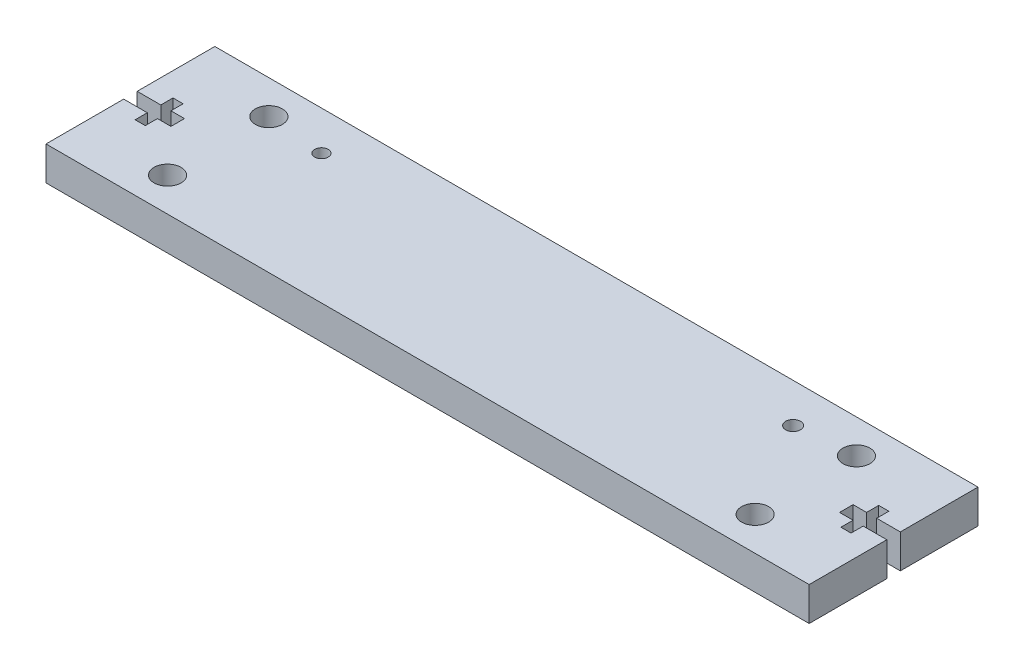
ISO-10303-21;
HEADER;
FILE_DESCRIPTION(('STEP AP214'),'2;1');
FILE_NAME('part.step','',(''),(''),'','','');
FILE_SCHEMA(('AUTOMOTIVE_DESIGN { 1 0 10303 214 1 1 1 1 }'));
ENDSEC;
DATA;
#1=APPLICATION_CONTEXT('core data for automotive mechanical design processes');
#2=APPLICATION_PROTOCOL_DEFINITION('international standard','automotive_design',2000,#1);
#3=PRODUCT_CONTEXT('',#1,'mechanical');
#4=PRODUCT('Part','Part','',(#3));
#5=PRODUCT_RELATED_PRODUCT_CATEGORY('part','',(#4));
#6=PRODUCT_DEFINITION_FORMATION('','',#4);
#7=PRODUCT_DEFINITION_CONTEXT('part definition',#1,'design');
#8=PRODUCT_DEFINITION('design','',#6,#7);
#9=PRODUCT_DEFINITION_SHAPE('','',#8);
#10=(LENGTH_UNIT() NAMED_UNIT(*) SI_UNIT(.MILLI.,.METRE.));
#11=(NAMED_UNIT(*) PLANE_ANGLE_UNIT() SI_UNIT($,.RADIAN.));
#12=(NAMED_UNIT(*) SI_UNIT($,.STERADIAN.) SOLID_ANGLE_UNIT());
#13=UNCERTAINTY_MEASURE_WITH_UNIT(LENGTH_MEASURE(1.E-05),#10,'distance_accuracy_value','');
#14=(GEOMETRIC_REPRESENTATION_CONTEXT(3) GLOBAL_UNCERTAINTY_ASSIGNED_CONTEXT((#13)) GLOBAL_UNIT_ASSIGNED_CONTEXT((#10,
#11,#12)) REPRESENTATION_CONTEXT('',''));
#15=CARTESIAN_POINT('',(0.,0.,0.));
#16=DIRECTION('',(0.,0.,1.));
#17=DIRECTION('',(1.,0.,0.));
#18=AXIS2_PLACEMENT_3D('',#15,#16,#17);
#19=CARTESIAN_POINT('',(-47.2682835486324,5.,-18.4839795938046));
#20=DIRECTION('',(1.,0.,0.));
#21=DIRECTION('',(0.,0.,-1.));
#22=AXIS2_PLACEMENT_3D('',#19,#20,#21);
#23=PLANE('',#22);
#24=DIRECTION('',(0.,1.,0.));
#25=VECTOR('',#24,1.);
#26=CARTESIAN_POINT('',(-47.2682835486325,0.,-6.98397959380457));
#27=LINE('',#26,#25);
#28=CARTESIAN_POINT('',(-47.2682835486325,0.,-6.98397959380457));
#29=VERTEX_POINT('',#28);
#30=CARTESIAN_POINT('',(-47.2682835486325,5.,-6.98397959380457));
#31=VERTEX_POINT('',#30);
#32=EDGE_CURVE('E349',#29,#31,#27,.T.);
#33=ORIENTED_EDGE('',*,*,#32,.T.);
#34=DIRECTION('',(0.,0.,1.));
#35=VECTOR('',#34,1.);
#36=CARTESIAN_POINT('',(-47.2682835486324,5.,-18.4839795938046));
#37=LINE('',#36,#35);
#38=CARTESIAN_POINT('',(-47.2682835486324,5.,-18.4839795938046));
#39=VERTEX_POINT('',#38);
#40=EDGE_CURVE('E455',#39,#31,#37,.T.);
#41=ORIENTED_EDGE('',*,*,#40,.F.);
#42=DIRECTION('',(0.,-1.,0.));
#43=VECTOR('',#42,1.);
#44=CARTESIAN_POINT('',(-47.2682835486324,5.,-18.4839795938046));
#45=LINE('',#44,#43);
#46=CARTESIAN_POINT('',(-47.2682835486324,0.,-18.4839795938046));
#47=VERTEX_POINT('',#46);
#48=EDGE_CURVE('E258',#39,#47,#45,.T.);
#49=ORIENTED_EDGE('',*,*,#48,.T.);
#50=DIRECTION('',(0.,0.,1.));
#51=VECTOR('',#50,1.);
#52=CARTESIAN_POINT('',(-47.2682835486324,0.,-18.4839795938046));
#53=LINE('',#52,#51);
#54=EDGE_CURVE('E240',#47,#29,#53,.T.);
#55=ORIENTED_EDGE('',*,*,#54,.T.);
#56=EDGE_LOOP('',(#33,#41,#49,#55));
#57=FACE_BOUND('',#56,.T.);
#58=ADVANCED_FACE('F32',(#57),#23,.F.);
#59=DIRECTION('',(0.,1.,0.));
#60=VECTOR('',#59,1.);
#61=CARTESIAN_POINT('',(-47.2682835486324,0.,-4.98397959380457));
#62=LINE('',#61,#60);
#63=CARTESIAN_POINT('',(-47.2682835486324,0.,-4.98397959380457));
#64=VERTEX_POINT('',#63);
#65=CARTESIAN_POINT('',(-47.2682835486324,5.,-4.98397959380457));
#66=VERTEX_POINT('',#65);
#67=EDGE_CURVE('E219',#64,#66,#62,.T.);
#68=ORIENTED_EDGE('',*,*,#67,.F.);
#69=CARTESIAN_POINT('',(-47.2682835486324,0.,6.51602040619537));
#70=VERTEX_POINT('',#69);
#71=EDGE_CURVE('E231',#64,#70,#53,.T.);
#72=ORIENTED_EDGE('',*,*,#71,.T.);
#73=DIRECTION('',(0.,-1.,0.));
#74=VECTOR('',#73,1.);
#75=CARTESIAN_POINT('',(-47.2682835486324,5.,6.51602040619537));
#76=LINE('',#75,#74);
#77=CARTESIAN_POINT('',(-47.2682835486324,5.,6.51602040619537));
#78=VERTEX_POINT('',#77);
#79=EDGE_CURVE('E11',#78,#70,#76,.T.);
#80=ORIENTED_EDGE('',*,*,#79,.F.);
#81=EDGE_CURVE('E233',#66,#78,#37,.T.);
#82=ORIENTED_EDGE('',*,*,#81,.F.);
#83=EDGE_LOOP('',(#68,#72,#80,#82));
#84=FACE_BOUND('',#83,.T.);
#85=ADVANCED_FACE('F229',(#84),#23,.F.);
#86=CARTESIAN_POINT('',(0.,5.,0.));
#87=DIRECTION('',(0.,1.,0.));
#88=DIRECTION('',(0.,0.,1.));
#89=AXIS2_PLACEMENT_3D('',#86,#87,#88);
#90=PLANE('',#89);
#91=CARTESIAN_POINT('',(-34.2682835486325,5.,1.51602040619537));
#92=DIRECTION('',(0.,1.,0.));
#93=DIRECTION('',(0.,0.,1.));
#94=AXIS2_PLACEMENT_3D('',#91,#92,#93);
#95=CIRCLE('',#94,2.);
#96=CARTESIAN_POINT('',(-34.2682835486325,5.,3.51602040619537));
#97=VERTEX_POINT('',#96);
#98=EDGE_CURVE('E282',#97,#97,#95,.T.);
#99=ORIENTED_EDGE('',*,*,#98,.F.);
#100=EDGE_LOOP('',(#99));
#101=FACE_BOUND('',#100,.T.);
#102=CARTESIAN_POINT('',(52.7317164513676,5.,-13.4839795938046));
#103=DIRECTION('',(0.,1.,0.));
#104=DIRECTION('',(0.,0.,1.));
#105=AXIS2_PLACEMENT_3D('',#102,#103,#104);
#106=CIRCLE('',#105,2.);
#107=CARTESIAN_POINT('',(52.7317164513676,5.,-11.4839795938046));
#108=VERTEX_POINT('',#107);
#109=EDGE_CURVE('E690',#108,#108,#106,.T.);
#110=ORIENTED_EDGE('',*,*,#109,.F.);
#111=EDGE_LOOP('',(#110));
#112=FACE_BOUND('',#111,.T.);
#113=CARTESIAN_POINT('',(52.7317164513676,5.,1.51602040619537));
#114=DIRECTION('',(0.,1.,0.));
#115=DIRECTION('',(0.,0.,1.));
#116=AXIS2_PLACEMENT_3D('',#113,#114,#115);
#117=CIRCLE('',#116,2.);
#118=CARTESIAN_POINT('',(52.7317164513676,5.,3.51602040619537));
#119=VERTEX_POINT('',#118);
#120=EDGE_CURVE('E295',#119,#119,#117,.T.);
#121=ORIENTED_EDGE('',*,*,#120,.F.);
#122=EDGE_LOOP('',(#121));
#123=FACE_BOUND('',#122,.T.);
#124=CARTESIAN_POINT('',(-34.2682835486325,5.,-13.4839795938046));
#125=DIRECTION('',(0.,1.,0.));
#126=DIRECTION('',(0.,0.,1.));
#127=AXIS2_PLACEMENT_3D('',#124,#125,#126);
#128=CIRCLE('',#127,2.);
#129=CARTESIAN_POINT('',(-34.2682835486325,5.,-11.4839795938046));
#130=VERTEX_POINT('',#129);
#131=EDGE_CURVE('E278',#130,#130,#128,.T.);
#132=ORIENTED_EDGE('',*,*,#131,.F.);
#133=EDGE_LOOP('',(#132));
#134=FACE_BOUND('',#133,.T.);
#135=CARTESIAN_POINT('',(44.1517164513676,5.,-12.6839795938046));
#136=DIRECTION('',(0.,1.,0.));
#137=DIRECTION('',(0.,0.,1.));
#138=AXIS2_PLACEMENT_3D('',#135,#136,#137);
#139=CIRCLE('',#138,1.1);
#140=CARTESIAN_POINT('',(44.1517164513676,5.,-11.5839795938046));
#141=VERTEX_POINT('',#140);
#142=EDGE_CURVE('E274',#141,#141,#139,.T.);
#143=ORIENTED_EDGE('',*,*,#142,.F.);
#144=EDGE_LOOP('',(#143));
#145=FACE_BOUND('',#144,.T.);
#146=CARTESIAN_POINT('',(-25.6882835486325,5.,-12.6839795938046));
#147=DIRECTION('',(0.,1.,0.));
#148=DIRECTION('',(0.,0.,1.));
#149=AXIS2_PLACEMENT_3D('',#146,#147,#148);
#150=CIRCLE('',#149,1.);
#151=CARTESIAN_POINT('',(-25.6882835486325,5.,-11.6839795938046));
#152=VERTEX_POINT('',#151);
#153=EDGE_CURVE('E270',#152,#152,#150,.T.);
#154=ORIENTED_EDGE('',*,*,#153,.F.);
#155=EDGE_LOOP('',(#154));
#156=FACE_BOUND('',#155,.T.);
#157=ORIENTED_EDGE('',*,*,#40,.T.);
#158=DIRECTION('',(1.,0.,0.));
#159=VECTOR('',#158,1.);
#160=CARTESIAN_POINT('',(-47.2682835486325,5.,-6.98397959380457));
#161=LINE('',#160,#159);
#162=CARTESIAN_POINT('',(-43.7682835486325,5.,-6.98397959380457));
#163=VERTEX_POINT('',#162);
#164=EDGE_CURVE('E225',#31,#163,#161,.T.);
#165=ORIENTED_EDGE('',*,*,#164,.T.);
#166=DIRECTION('',(0.,0.,-1.));
#167=VECTOR('',#166,1.);
#168=CARTESIAN_POINT('',(-43.7682835486325,5.,-6.98397959380457));
#169=LINE('',#168,#167);
#170=CARTESIAN_POINT('',(-43.7682835486325,5.,-8.78397959380457));
#171=VERTEX_POINT('',#170);
#172=EDGE_CURVE('E344',#163,#171,#169,.T.);
#173=ORIENTED_EDGE('',*,*,#172,.T.);
#174=DIRECTION('',(1.,0.,0.));
#175=VECTOR('',#174,1.);
#176=CARTESIAN_POINT('',(-42.2682835486324,5.,-8.78397959380458));
#177=LINE('',#176,#175);
#178=CARTESIAN_POINT('',(-42.2682835486324,5.,-8.78397959380458));
#179=VERTEX_POINT('',#178);
#180=EDGE_CURVE('E341',#171,#179,#177,.T.);
#181=ORIENTED_EDGE('',*,*,#180,.T.);
#182=DIRECTION('',(0.,0.,1.));
#183=VECTOR('',#182,1.);
#184=CARTESIAN_POINT('',(-42.2682835486324,5.,-8.78397959380458));
#185=LINE('',#184,#183);
#186=CARTESIAN_POINT('',(-42.2682835486324,5.,-6.98397959380458));
#187=VERTEX_POINT('',#186);
#188=EDGE_CURVE('E338',#179,#187,#185,.T.);
#189=ORIENTED_EDGE('',*,*,#188,.T.);
#190=DIRECTION('',(1.,0.,0.));
#191=VECTOR('',#190,1.);
#192=CARTESIAN_POINT('',(-42.2682835486324,5.,-6.98397959380458));
#193=LINE('',#192,#191);
#194=CARTESIAN_POINT('',(-40.2682835486324,5.,-6.98397959380458));
#195=VERTEX_POINT('',#194);
#196=EDGE_CURVE('E335',#187,#195,#193,.T.);
#197=ORIENTED_EDGE('',*,*,#196,.T.);
#198=DIRECTION('',(0.,0.,1.));
#199=VECTOR('',#198,1.);
#200=CARTESIAN_POINT('',(-40.2682835486324,5.,-6.98397959380458));
#201=LINE('',#200,#199);
#202=CARTESIAN_POINT('',(-40.2682835486324,5.,-4.98397959380458));
#203=VERTEX_POINT('',#202);
#204=EDGE_CURVE('E332',#195,#203,#201,.T.);
#205=ORIENTED_EDGE('',*,*,#204,.T.);
#206=DIRECTION('',(-1.,0.,0.));
#207=VECTOR('',#206,1.);
#208=CARTESIAN_POINT('',(-42.2682835486324,5.,-4.98397959380458));
#209=LINE('',#208,#207);
#210=CARTESIAN_POINT('',(-42.2682835486324,5.,-4.98397959380458));
#211=VERTEX_POINT('',#210);
#212=EDGE_CURVE('E329',#203,#211,#209,.T.);
#213=ORIENTED_EDGE('',*,*,#212,.T.);
#214=DIRECTION('',(0.,0.,1.));
#215=VECTOR('',#214,1.);
#216=CARTESIAN_POINT('',(-42.2682835486324,5.,-4.98397959380458));
#217=LINE('',#216,#215);
#218=CARTESIAN_POINT('',(-42.2682835486324,5.,-3.18397959380458));
#219=VERTEX_POINT('',#218);
#220=EDGE_CURVE('E326',#211,#219,#217,.T.);
#221=ORIENTED_EDGE('',*,*,#220,.T.);
#222=DIRECTION('',(-1.,0.,0.));
#223=VECTOR('',#222,1.);
#224=CARTESIAN_POINT('',(-42.2682835486324,5.,-3.18397959380458));
#225=LINE('',#224,#223);
#226=CARTESIAN_POINT('',(-43.7682835486325,5.,-3.18397959380457));
#227=VERTEX_POINT('',#226);
#228=EDGE_CURVE('E323',#219,#227,#225,.T.);
#229=ORIENTED_EDGE('',*,*,#228,.T.);
#230=DIRECTION('',(0.,0.,-1.));
#231=VECTOR('',#230,1.);
#232=CARTESIAN_POINT('',(-43.7682835486325,5.,-3.18397959380457));
#233=LINE('',#232,#231);
#234=CARTESIAN_POINT('',(-43.7682835486325,5.,-4.98397959380457));
#235=VERTEX_POINT('',#234);
#236=EDGE_CURVE('E320',#227,#235,#233,.T.);
#237=ORIENTED_EDGE('',*,*,#236,.T.);
#238=DIRECTION('',(-1.,0.,0.));
#239=VECTOR('',#238,1.);
#240=CARTESIAN_POINT('',(-47.2682835486324,5.,-4.98397959380457));
#241=LINE('',#240,#239);
#242=EDGE_CURVE('E269',#235,#66,#241,.T.);
#243=ORIENTED_EDGE('',*,*,#242,.T.);
#244=ORIENTED_EDGE('',*,*,#81,.T.);
#245=DIRECTION('',(1.,0.,0.));
#246=VECTOR('',#245,1.);
#247=CARTESIAN_POINT('',(-47.2682835486324,5.,6.51602040619537));
#248=LINE('',#247,#246);
#249=CARTESIAN_POINT('',(65.7317164513676,5.,6.51602040619537));
#250=VERTEX_POINT('',#249);
#251=EDGE_CURVE('E458',#78,#250,#248,.T.);
#252=ORIENTED_EDGE('',*,*,#251,.T.);
#253=DIRECTION('',(0.,0.,-1.));
#254=VECTOR('',#253,1.);
#255=CARTESIAN_POINT('',(65.7317164513675,5.,-18.4839795938046));
#256=LINE('',#255,#254);
#257=CARTESIAN_POINT('',(65.7317164513676,5.,-4.98397959380463));
#258=VERTEX_POINT('',#257);
#259=EDGE_CURVE('E460',#250,#258,#256,.T.);
#260=ORIENTED_EDGE('',*,*,#259,.T.);
#261=DIRECTION('',(1.,0.,0.));
#262=VECTOR('',#261,1.);
#263=CARTESIAN_POINT('',(65.7317164513676,5.,-4.98397959380463));
#264=LINE('',#263,#262);
#265=CARTESIAN_POINT('',(62.2317164513676,5.,-4.98397959380463));
#266=VERTEX_POINT('',#265);
#267=EDGE_CURVE('E375',#266,#258,#264,.T.);
#268=ORIENTED_EDGE('',*,*,#267,.F.);
#269=DIRECTION('',(0.,0.,-1.));
#270=VECTOR('',#269,1.);
#271=CARTESIAN_POINT('',(62.2317164513676,5.,-3.18397959380463));
#272=LINE('',#271,#270);
#273=CARTESIAN_POINT('',(62.2317164513676,5.,-3.18397959380463));
#274=VERTEX_POINT('',#273);
#275=EDGE_CURVE('E431',#274,#266,#272,.T.);
#276=ORIENTED_EDGE('',*,*,#275,.F.);
#277=DIRECTION('',(1.,0.,0.));
#278=VECTOR('',#277,1.);
#279=CARTESIAN_POINT('',(60.7317164513676,5.,-3.18397959380463));
#280=LINE('',#279,#278);
#281=CARTESIAN_POINT('',(60.7317164513676,5.,-3.18397959380463));
#282=VERTEX_POINT('',#281);
#283=EDGE_CURVE('E428',#282,#274,#280,.T.);
#284=ORIENTED_EDGE('',*,*,#283,.F.);
#285=DIRECTION('',(0.,0.,1.));
#286=VECTOR('',#285,1.);
#287=CARTESIAN_POINT('',(60.7317164513676,5.,-4.98397959380463));
#288=LINE('',#287,#286);
#289=CARTESIAN_POINT('',(60.7317164513676,5.,-4.98397959380463));
#290=VERTEX_POINT('',#289);
#291=EDGE_CURVE('E425',#290,#282,#288,.T.);
#292=ORIENTED_EDGE('',*,*,#291,.F.);
#293=DIRECTION('',(1.,0.,0.));
#294=VECTOR('',#293,1.);
#295=CARTESIAN_POINT('',(60.7317164513676,5.,-4.98397959380463));
#296=LINE('',#295,#294);
#297=CARTESIAN_POINT('',(58.7317164513676,5.,-4.98397959380463));
#298=VERTEX_POINT('',#297);
#299=EDGE_CURVE('E422',#298,#290,#296,.T.);
#300=ORIENTED_EDGE('',*,*,#299,.F.);
#301=DIRECTION('',(0.,0.,1.));
#302=VECTOR('',#301,1.);
#303=CARTESIAN_POINT('',(58.7317164513676,5.,-6.98397959380463));
#304=LINE('',#303,#302);
#305=CARTESIAN_POINT('',(58.7317164513676,5.,-6.98397959380463));
#306=VERTEX_POINT('',#305);
#307=EDGE_CURVE('E419',#306,#298,#304,.T.);
#308=ORIENTED_EDGE('',*,*,#307,.F.);
#309=DIRECTION('',(-1.,0.,0.));
#310=VECTOR('',#309,1.);
#311=CARTESIAN_POINT('',(60.7317164513676,5.,-6.98397959380463));
#312=LINE('',#311,#310);
#313=CARTESIAN_POINT('',(60.7317164513676,5.,-6.98397959380463));
#314=VERTEX_POINT('',#313);
#315=EDGE_CURVE('E416',#314,#306,#312,.T.);
#316=ORIENTED_EDGE('',*,*,#315,.F.);
#317=DIRECTION('',(0.,0.,1.));
#318=VECTOR('',#317,1.);
#319=CARTESIAN_POINT('',(60.7317164513676,5.,-8.78397959380463));
#320=LINE('',#319,#318);
#321=CARTESIAN_POINT('',(60.7317164513676,5.,-8.78397959380463));
#322=VERTEX_POINT('',#321);
#323=EDGE_CURVE('E413',#322,#314,#320,.T.);
#324=ORIENTED_EDGE('',*,*,#323,.F.);
#325=DIRECTION('',(-1.,0.,0.));
#326=VECTOR('',#325,1.);
#327=CARTESIAN_POINT('',(60.7317164513676,5.,-8.78397959380463));
#328=LINE('',#327,#326);
#329=CARTESIAN_POINT('',(62.2317164513676,5.,-8.78397959380463));
#330=VERTEX_POINT('',#329);
#331=EDGE_CURVE('E410',#330,#322,#328,.T.);
#332=ORIENTED_EDGE('',*,*,#331,.F.);
#333=DIRECTION('',(0.,0.,-1.));
#334=VECTOR('',#333,1.);
#335=CARTESIAN_POINT('',(62.2317164513676,5.,-6.98397959380463));
#336=LINE('',#335,#334);
#337=CARTESIAN_POINT('',(62.2317164513676,5.,-6.98397959380463));
#338=VERTEX_POINT('',#337);
#339=EDGE_CURVE('E407',#338,#330,#336,.T.);
#340=ORIENTED_EDGE('',*,*,#339,.F.);
#341=DIRECTION('',(-1.,0.,0.));
#342=VECTOR('',#341,1.);
#343=CARTESIAN_POINT('',(65.7317164513676,5.,-6.98397959380463));
#344=LINE('',#343,#342);
#345=CARTESIAN_POINT('',(65.7317164513676,5.,-6.98397959380463));
#346=VERTEX_POINT('',#345);
#347=EDGE_CURVE('E352',#346,#338,#344,.T.);
#348=ORIENTED_EDGE('',*,*,#347,.F.);
#349=CARTESIAN_POINT('',(65.7317164513675,5.,-18.4839795938046));
#350=VERTEX_POINT('',#349);
#351=EDGE_CURVE('E459',#346,#350,#256,.T.);
#352=ORIENTED_EDGE('',*,*,#351,.T.);
#353=DIRECTION('',(-1.,0.,0.));
#354=VECTOR('',#353,1.);
#355=CARTESIAN_POINT('',(-47.2682835486324,5.,-18.4839795938046));
#356=LINE('',#355,#354);
#357=EDGE_CURVE('E249',#350,#39,#356,.T.);
#358=ORIENTED_EDGE('',*,*,#357,.T.);
#359=EDGE_LOOP('',(#157,#165,#173,#181,#189,#197,#205,#213,#221,#229,#237,#243,#244,#252,#260,
#268,#276,#284,#292,#300,#308,#316,#324,#332,#340,#348,#352,#358));
#360=FACE_BOUND('',#359,.T.);
#361=ADVANCED_FACE('F468',(#101,#112,#123,#134,#145,#156,#360),#90,.T.);
#362=CARTESIAN_POINT('',(0.,0.,0.));
#363=DIRECTION('',(0.,1.,0.));
#364=DIRECTION('',(0.,0.,1.));
#365=AXIS2_PLACEMENT_3D('',#362,#363,#364);
#366=PLANE('',#365);
#367=CARTESIAN_POINT('',(-34.2682835486325,0.,1.51602040619537));
#368=DIRECTION('',(0.,1.,0.));
#369=DIRECTION('',(0.,0.,1.));
#370=AXIS2_PLACEMENT_3D('',#367,#368,#369);
#371=CIRCLE('',#370,2.);
#372=CARTESIAN_POINT('',(-34.2682835486325,0.,3.51602040619537));
#373=VERTEX_POINT('',#372);
#374=EDGE_CURVE('E35',#373,#373,#371,.T.);
#375=ORIENTED_EDGE('',*,*,#374,.T.);
#376=EDGE_LOOP('',(#375));
#377=FACE_BOUND('',#376,.T.);
#378=CARTESIAN_POINT('',(52.7317164513676,0.,-13.4839795938046));
#379=DIRECTION('',(0.,1.,0.));
#380=DIRECTION('',(0.,0.,1.));
#381=AXIS2_PLACEMENT_3D('',#378,#379,#380);
#382=CIRCLE('',#381,2.);
#383=CARTESIAN_POINT('',(52.7317164513676,0.,-11.4839795938046));
#384=VERTEX_POINT('',#383);
#385=EDGE_CURVE('E281',#384,#384,#382,.T.);
#386=ORIENTED_EDGE('',*,*,#385,.T.);
#387=EDGE_LOOP('',(#386));
#388=FACE_BOUND('',#387,.T.);
#389=CARTESIAN_POINT('',(52.7317164513676,0.,1.51602040619537));
#390=DIRECTION('',(0.,1.,0.));
#391=DIRECTION('',(0.,0.,1.));
#392=AXIS2_PLACEMENT_3D('',#389,#390,#391);
#393=CIRCLE('',#392,2.);
#394=CARTESIAN_POINT('',(52.7317164513676,0.,3.51602040619537));
#395=VERTEX_POINT('',#394);
#396=EDGE_CURVE('E279',#395,#395,#393,.T.);
#397=ORIENTED_EDGE('',*,*,#396,.T.);
#398=EDGE_LOOP('',(#397));
#399=FACE_BOUND('',#398,.T.);
#400=CARTESIAN_POINT('',(-34.2682835486325,0.,-13.4839795938046));
#401=DIRECTION('',(0.,1.,0.));
#402=DIRECTION('',(0.,0.,1.));
#403=AXIS2_PLACEMENT_3D('',#400,#401,#402);
#404=CIRCLE('',#403,2.);
#405=CARTESIAN_POINT('',(-34.2682835486325,0.,-11.4839795938046));
#406=VERTEX_POINT('',#405);
#407=EDGE_CURVE('E275',#406,#406,#404,.T.);
#408=ORIENTED_EDGE('',*,*,#407,.T.);
#409=EDGE_LOOP('',(#408));
#410=FACE_BOUND('',#409,.T.);
#411=CARTESIAN_POINT('',(44.1517164513676,0.,-12.6839795938046));
#412=DIRECTION('',(0.,1.,0.));
#413=DIRECTION('',(0.,0.,1.));
#414=AXIS2_PLACEMENT_3D('',#411,#412,#413);
#415=CIRCLE('',#414,1.1);
#416=CARTESIAN_POINT('',(44.1517164513676,0.,-11.5839795938046));
#417=VERTEX_POINT('',#416);
#418=EDGE_CURVE('E271',#417,#417,#415,.T.);
#419=ORIENTED_EDGE('',*,*,#418,.T.);
#420=EDGE_LOOP('',(#419));
#421=FACE_BOUND('',#420,.T.);
#422=CARTESIAN_POINT('',(-25.6882835486325,0.,-12.6839795938046));
#423=DIRECTION('',(0.,1.,0.));
#424=DIRECTION('',(0.,0.,1.));
#425=AXIS2_PLACEMENT_3D('',#422,#423,#424);
#426=CIRCLE('',#425,1.);
#427=CARTESIAN_POINT('',(-25.6882835486325,0.,-11.6839795938046));
#428=VERTEX_POINT('',#427);
#429=EDGE_CURVE('E266',#428,#428,#426,.T.);
#430=ORIENTED_EDGE('',*,*,#429,.T.);
#431=EDGE_LOOP('',(#430));
#432=FACE_BOUND('',#431,.T.);
#433=DIRECTION('',(1.,0.,0.));
#434=VECTOR('',#433,1.);
#435=CARTESIAN_POINT('',(-47.2682835486325,0.,-6.98397959380457));
#436=LINE('',#435,#434);
#437=CARTESIAN_POINT('',(-43.7682835486325,0.,-6.98397959380457));
#438=VERTEX_POINT('',#437);
#439=EDGE_CURVE('E234',#29,#438,#436,.T.);
#440=ORIENTED_EDGE('',*,*,#439,.F.);
#441=ORIENTED_EDGE('',*,*,#54,.F.);
#442=DIRECTION('',(-1.,0.,0.));
#443=VECTOR('',#442,1.);
#444=CARTESIAN_POINT('',(-47.2682835486324,0.,-18.4839795938046));
#445=LINE('',#444,#443);
#446=CARTESIAN_POINT('',(65.7317164513675,0.,-18.4839795938046));
#447=VERTEX_POINT('',#446);
#448=EDGE_CURVE('E256',#447,#47,#445,.T.);
#449=ORIENTED_EDGE('',*,*,#448,.F.);
#450=DIRECTION('',(0.,0.,-1.));
#451=VECTOR('',#450,1.);
#452=CARTESIAN_POINT('',(65.7317164513675,0.,-18.4839795938046));
#453=LINE('',#452,#451);
#454=CARTESIAN_POINT('',(65.7317164513676,0.,-6.98397959380463));
#455=VERTEX_POINT('',#454);
#456=EDGE_CURVE('E252',#455,#447,#453,.T.);
#457=ORIENTED_EDGE('',*,*,#456,.F.);
#458=DIRECTION('',(-1.,0.,0.));
#459=VECTOR('',#458,1.);
#460=CARTESIAN_POINT('',(65.7317164513676,0.,-6.98397959380463));
#461=LINE('',#460,#459);
#462=CARTESIAN_POINT('',(62.2317164513676,0.,-6.98397959380463));
#463=VERTEX_POINT('',#462);
#464=EDGE_CURVE('E372',#455,#463,#461,.T.);
#465=ORIENTED_EDGE('',*,*,#464,.T.);
#466=DIRECTION('',(0.,0.,-1.));
#467=VECTOR('',#466,1.);
#468=CARTESIAN_POINT('',(62.2317164513676,0.,-6.98397959380463));
#469=LINE('',#468,#467);
#470=CARTESIAN_POINT('',(62.2317164513676,0.,-8.78397959380463));
#471=VERTEX_POINT('',#470);
#472=EDGE_CURVE('E56',#463,#471,#469,.T.);
#473=ORIENTED_EDGE('',*,*,#472,.T.);
#474=DIRECTION('',(-1.,0.,0.));
#475=VECTOR('',#474,1.);
#476=CARTESIAN_POINT('',(60.7317164513676,0.,-8.78397959380463));
#477=LINE('',#476,#475);
#478=CARTESIAN_POINT('',(60.7317164513676,0.,-8.78397959380463));
#479=VERTEX_POINT('',#478);
#480=EDGE_CURVE('E377',#471,#479,#477,.T.);
#481=ORIENTED_EDGE('',*,*,#480,.T.);
#482=DIRECTION('',(0.,0.,1.));
#483=VECTOR('',#482,1.);
#484=CARTESIAN_POINT('',(60.7317164513676,0.,-8.78397959380463));
#485=LINE('',#484,#483);
#486=CARTESIAN_POINT('',(60.7317164513676,0.,-6.98397959380463));
#487=VERTEX_POINT('',#486);
#488=EDGE_CURVE('E380',#479,#487,#485,.T.);
#489=ORIENTED_EDGE('',*,*,#488,.T.);
#490=DIRECTION('',(-1.,0.,0.));
#491=VECTOR('',#490,1.);
#492=CARTESIAN_POINT('',(60.7317164513676,0.,-6.98397959380463));
#493=LINE('',#492,#491);
#494=CARTESIAN_POINT('',(58.7317164513676,0.,-6.98397959380463));
#495=VERTEX_POINT('',#494);
#496=EDGE_CURVE('E383',#487,#495,#493,.T.);
#497=ORIENTED_EDGE('',*,*,#496,.T.);
#498=DIRECTION('',(0.,0.,1.));
#499=VECTOR('',#498,1.);
#500=CARTESIAN_POINT('',(58.7317164513676,0.,-6.98397959380463));
#501=LINE('',#500,#499);
#502=CARTESIAN_POINT('',(58.7317164513676,0.,-4.98397959380463));
#503=VERTEX_POINT('',#502);
#504=EDGE_CURVE('E386',#495,#503,#501,.T.);
#505=ORIENTED_EDGE('',*,*,#504,.T.);
#506=DIRECTION('',(1.,0.,0.));
#507=VECTOR('',#506,1.);
#508=CARTESIAN_POINT('',(60.7317164513676,0.,-4.98397959380463));
#509=LINE('',#508,#507);
#510=CARTESIAN_POINT('',(60.7317164513676,0.,-4.98397959380463));
#511=VERTEX_POINT('',#510);
#512=EDGE_CURVE('E389',#503,#511,#509,.T.);
#513=ORIENTED_EDGE('',*,*,#512,.T.);
#514=DIRECTION('',(0.,0.,1.));
#515=VECTOR('',#514,1.);
#516=CARTESIAN_POINT('',(60.7317164513676,0.,-4.98397959380463));
#517=LINE('',#516,#515);
#518=CARTESIAN_POINT('',(60.7317164513676,0.,-3.18397959380463));
#519=VERTEX_POINT('',#518);
#520=EDGE_CURVE('E392',#511,#519,#517,.T.);
#521=ORIENTED_EDGE('',*,*,#520,.T.);
#522=DIRECTION('',(1.,0.,0.));
#523=VECTOR('',#522,1.);
#524=CARTESIAN_POINT('',(60.7317164513676,0.,-3.18397959380463));
#525=LINE('',#524,#523);
#526=CARTESIAN_POINT('',(62.2317164513676,0.,-3.18397959380463));
#527=VERTEX_POINT('',#526);
#528=EDGE_CURVE('E395',#519,#527,#525,.T.);
#529=ORIENTED_EDGE('',*,*,#528,.T.);
#530=DIRECTION('',(0.,0.,-1.));
#531=VECTOR('',#530,1.);
#532=CARTESIAN_POINT('',(62.2317164513676,0.,-3.18397959380463));
#533=LINE('',#532,#531);
#534=CARTESIAN_POINT('',(62.2317164513676,0.,-4.98397959380463));
#535=VERTEX_POINT('',#534);
#536=EDGE_CURVE('E398',#527,#535,#533,.T.);
#537=ORIENTED_EDGE('',*,*,#536,.T.);
#538=DIRECTION('',(1.,0.,0.));
#539=VECTOR('',#538,1.);
#540=CARTESIAN_POINT('',(65.7317164513676,0.,-4.98397959380463));
#541=LINE('',#540,#539);
#542=CARTESIAN_POINT('',(65.7317164513676,0.,-4.98397959380463));
#543=VERTEX_POINT('',#542);
#544=EDGE_CURVE('E401',#535,#543,#541,.T.);
#545=ORIENTED_EDGE('',*,*,#544,.T.);
#546=CARTESIAN_POINT('',(65.7317164513676,0.,6.51602040619537));
#547=VERTEX_POINT('',#546);
#548=EDGE_CURVE('E253',#547,#543,#453,.T.);
#549=ORIENTED_EDGE('',*,*,#548,.F.);
#550=DIRECTION('',(1.,0.,0.));
#551=VECTOR('',#550,1.);
#552=CARTESIAN_POINT('',(-47.2682835486324,0.,6.51602040619537));
#553=LINE('',#552,#551);
#554=EDGE_CURVE('E239',#70,#547,#553,.T.);
#555=ORIENTED_EDGE('',*,*,#554,.F.);
#556=ORIENTED_EDGE('',*,*,#71,.F.);
#557=DIRECTION('',(-1.,0.,0.));
#558=VECTOR('',#557,1.);
#559=CARTESIAN_POINT('',(-47.2682835486324,0.,-4.98397959380457));
#560=LINE('',#559,#558);
#561=CARTESIAN_POINT('',(-43.7682835486325,0.,-4.98397959380458));
#562=VERTEX_POINT('',#561);
#563=EDGE_CURVE('E216',#562,#64,#560,.T.);
#564=ORIENTED_EDGE('',*,*,#563,.F.);
#565=DIRECTION('',(0.,0.,-1.));
#566=VECTOR('',#565,1.);
#567=CARTESIAN_POINT('',(-43.7682835486325,0.,-3.18397959380457));
#568=LINE('',#567,#566);
#569=CARTESIAN_POINT('',(-43.7682835486325,0.,-3.18397959380457));
#570=VERTEX_POINT('',#569);
#571=EDGE_CURVE('E224',#570,#562,#568,.T.);
#572=ORIENTED_EDGE('',*,*,#571,.F.);
#573=DIRECTION('',(-1.,0.,0.));
#574=VECTOR('',#573,1.);
#575=CARTESIAN_POINT('',(-42.2682835486324,0.,-3.18397959380458));
#576=LINE('',#575,#574);
#577=CARTESIAN_POINT('',(-42.2682835486324,0.,-3.18397959380458));
#578=VERTEX_POINT('',#577);
#579=EDGE_CURVE('E302',#578,#570,#576,.T.);
#580=ORIENTED_EDGE('',*,*,#579,.F.);
#581=DIRECTION('',(0.,0.,1.));
#582=VECTOR('',#581,1.);
#583=CARTESIAN_POINT('',(-42.2682835486324,0.,-4.98397959380458));
#584=LINE('',#583,#582);
#585=CARTESIAN_POINT('',(-42.2682835486324,0.,-4.98397959380458));
#586=VERTEX_POINT('',#585);
#587=EDGE_CURVE('E304',#586,#578,#584,.T.);
#588=ORIENTED_EDGE('',*,*,#587,.F.);
#589=DIRECTION('',(-1.,0.,0.));
#590=VECTOR('',#589,1.);
#591=CARTESIAN_POINT('',(-42.2682835486324,0.,-4.98397959380458));
#592=LINE('',#591,#590);
#593=CARTESIAN_POINT('',(-40.2682835486324,0.,-4.98397959380458));
#594=VERTEX_POINT('',#593);
#595=EDGE_CURVE('E306',#594,#586,#592,.T.);
#596=ORIENTED_EDGE('',*,*,#595,.F.);
#597=DIRECTION('',(0.,0.,1.));
#598=VECTOR('',#597,1.);
#599=CARTESIAN_POINT('',(-40.2682835486324,0.,-6.98397959380458));
#600=LINE('',#599,#598);
#601=CARTESIAN_POINT('',(-40.2682835486324,0.,-6.98397959380458));
#602=VERTEX_POINT('',#601);
#603=EDGE_CURVE('E308',#602,#594,#600,.T.);
#604=ORIENTED_EDGE('',*,*,#603,.F.);
#605=DIRECTION('',(1.,0.,0.));
#606=VECTOR('',#605,1.);
#607=CARTESIAN_POINT('',(-42.2682835486324,0.,-6.98397959380458));
#608=LINE('',#607,#606);
#609=CARTESIAN_POINT('',(-42.2682835486324,0.,-6.98397959380458));
#610=VERTEX_POINT('',#609);
#611=EDGE_CURVE('E310',#610,#602,#608,.T.);
#612=ORIENTED_EDGE('',*,*,#611,.F.);
#613=DIRECTION('',(0.,0.,1.));
#614=VECTOR('',#613,1.);
#615=CARTESIAN_POINT('',(-42.2682835486324,0.,-8.78397959380458));
#616=LINE('',#615,#614);
#617=CARTESIAN_POINT('',(-42.2682835486324,0.,-8.78397959380458));
#618=VERTEX_POINT('',#617);
#619=EDGE_CURVE('E312',#618,#610,#616,.T.);
#620=ORIENTED_EDGE('',*,*,#619,.F.);
#621=DIRECTION('',(1.,0.,0.));
#622=VECTOR('',#621,1.);
#623=CARTESIAN_POINT('',(-42.2682835486324,0.,-8.78397959380458));
#624=LINE('',#623,#622);
#625=CARTESIAN_POINT('',(-43.7682835486325,0.,-8.78397959380457));
#626=VERTEX_POINT('',#625);
#627=EDGE_CURVE('E314',#626,#618,#624,.T.);
#628=ORIENTED_EDGE('',*,*,#627,.F.);
#629=DIRECTION('',(0.,0.,-1.));
#630=VECTOR('',#629,1.);
#631=CARTESIAN_POINT('',(-43.7682835486325,0.,-6.98397959380457));
#632=LINE('',#631,#630);
#633=EDGE_CURVE('E316',#438,#626,#632,.T.);
#634=ORIENTED_EDGE('',*,*,#633,.F.);
#635=EDGE_LOOP('',(#440,#441,#449,#457,#465,#473,#481,#489,#497,#505,#513,#521,#529,#537,#545,
#549,#555,#556,#564,#572,#580,#588,#596,#604,#612,#620,#628,#634));
#636=FACE_BOUND('',#635,.T.);
#637=ADVANCED_FACE('F237',(#377,#388,#399,#410,#421,#432,#636),#366,.F.);
#638=CARTESIAN_POINT('',(65.7317164513675,5.,-18.4839795938046));
#639=DIRECTION('',(-1.,0.,0.));
#640=DIRECTION('',(0.,0.,1.));
#641=AXIS2_PLACEMENT_3D('',#638,#639,#640);
#642=PLANE('',#641);
#643=ORIENTED_EDGE('',*,*,#548,.T.);
#644=DIRECTION('',(0.,1.,0.));
#645=VECTOR('',#644,1.);
#646=CARTESIAN_POINT('',(65.7317164513676,0.,-4.98397959380463));
#647=LINE('',#646,#645);
#648=EDGE_CURVE('E241',#543,#258,#647,.T.);
#649=ORIENTED_EDGE('',*,*,#648,.T.);
#650=ORIENTED_EDGE('',*,*,#259,.F.);
#651=DIRECTION('',(0.,-1.,0.));
#652=VECTOR('',#651,1.);
#653=CARTESIAN_POINT('',(65.7317164513676,5.,6.51602040619537));
#654=LINE('',#653,#652);
#655=EDGE_CURVE('E40',#250,#547,#654,.T.);
#656=ORIENTED_EDGE('',*,*,#655,.T.);
#657=EDGE_LOOP('',(#643,#649,#650,#656));
#658=FACE_BOUND('',#657,.T.);
#659=ADVANCED_FACE('F567',(#658),#642,.F.);
#660=CARTESIAN_POINT('',(-47.2682835486324,5.,6.51602040619537));
#661=DIRECTION('',(0.,0.,-1.));
#662=DIRECTION('',(-1.,0.,0.));
#663=AXIS2_PLACEMENT_3D('',#660,#661,#662);
#664=PLANE('',#663);
#665=ORIENTED_EDGE('',*,*,#554,.T.);
#666=ORIENTED_EDGE('',*,*,#655,.F.);
#667=ORIENTED_EDGE('',*,*,#251,.F.);
#668=ORIENTED_EDGE('',*,*,#79,.T.);
#669=EDGE_LOOP('',(#665,#666,#667,#668));
#670=FACE_BOUND('',#669,.T.);
#671=ADVANCED_FACE('F571',(#670),#664,.F.);
#672=ORIENTED_EDGE('',*,*,#351,.F.);
#673=DIRECTION('',(0.,1.,0.));
#674=VECTOR('',#673,1.);
#675=CARTESIAN_POINT('',(65.7317164513676,0.,-6.98397959380463));
#676=LINE('',#675,#674);
#677=EDGE_CURVE('E404',#455,#346,#676,.T.);
#678=ORIENTED_EDGE('',*,*,#677,.F.);
#679=ORIENTED_EDGE('',*,*,#456,.T.);
#680=DIRECTION('',(0.,-1.,0.));
#681=VECTOR('',#680,1.);
#682=CARTESIAN_POINT('',(65.7317164513675,5.,-18.4839795938046));
#683=LINE('',#682,#681);
#684=EDGE_CURVE('E261',#350,#447,#683,.T.);
#685=ORIENTED_EDGE('',*,*,#684,.F.);
#686=EDGE_LOOP('',(#672,#678,#679,#685));
#687=FACE_BOUND('',#686,.T.);
#688=ADVANCED_FACE('F474',(#687),#642,.F.);
#689=CARTESIAN_POINT('',(-47.2682835486324,5.,-18.4839795938046));
#690=DIRECTION('',(0.,0.,1.));
#691=DIRECTION('',(1.,0.,0.));
#692=AXIS2_PLACEMENT_3D('',#689,#690,#691);
#693=PLANE('',#692);
#694=ORIENTED_EDGE('',*,*,#448,.T.);
#695=ORIENTED_EDGE('',*,*,#48,.F.);
#696=ORIENTED_EDGE('',*,*,#357,.F.);
#697=ORIENTED_EDGE('',*,*,#684,.T.);
#698=EDGE_LOOP('',(#694,#695,#696,#697));
#699=FACE_BOUND('',#698,.T.);
#700=ADVANCED_FACE('F478',(#699),#693,.F.);
#701=CARTESIAN_POINT('',(65.7317164513676,0.,-4.98397959380463));
#702=DIRECTION('',(0.,0.,1.));
#703=DIRECTION('',(1.,0.,0.));
#704=AXIS2_PLACEMENT_3D('',#701,#702,#703);
#705=PLANE('',#704);
#706=ORIENTED_EDGE('',*,*,#267,.T.);
#707=ORIENTED_EDGE('',*,*,#648,.F.);
#708=ORIENTED_EDGE('',*,*,#544,.F.);
#709=DIRECTION('',(0.,1.,0.));
#710=VECTOR('',#709,1.);
#711=CARTESIAN_POINT('',(62.2317164513676,0.,-4.98397959380463));
#712=LINE('',#711,#710);
#713=EDGE_CURVE('E245',#535,#266,#712,.T.);
#714=ORIENTED_EDGE('',*,*,#713,.T.);
#715=EDGE_LOOP('',(#706,#707,#708,#714));
#716=FACE_BOUND('',#715,.T.);
#717=ADVANCED_FACE('F565',(#716),#705,.F.);
#718=CARTESIAN_POINT('',(62.2317164513676,0.,-3.18397959380463));
#719=DIRECTION('',(1.,0.,0.));
#720=DIRECTION('',(0.,0.,-1.));
#721=AXIS2_PLACEMENT_3D('',#718,#719,#720);
#722=PLANE('',#721);
#723=ORIENTED_EDGE('',*,*,#275,.T.);
#724=ORIENTED_EDGE('',*,*,#713,.F.);
#725=ORIENTED_EDGE('',*,*,#536,.F.);
#726=DIRECTION('',(0.,1.,0.));
#727=VECTOR('',#726,1.);
#728=CARTESIAN_POINT('',(62.2317164513676,0.,-3.18397959380463));
#729=LINE('',#728,#727);
#730=EDGE_CURVE('E436',#527,#274,#729,.T.);
#731=ORIENTED_EDGE('',*,*,#730,.T.);
#732=EDGE_LOOP('',(#723,#724,#725,#731));
#733=FACE_BOUND('',#732,.T.);
#734=ADVANCED_FACE('F562',(#733),#722,.F.);
#735=CARTESIAN_POINT('',(60.7317164513676,0.,-3.18397959380463));
#736=DIRECTION('',(0.,0.,1.));
#737=DIRECTION('',(1.,0.,0.));
#738=AXIS2_PLACEMENT_3D('',#735,#736,#737);
#739=PLANE('',#738);
#740=ORIENTED_EDGE('',*,*,#283,.T.);
#741=ORIENTED_EDGE('',*,*,#730,.F.);
#742=ORIENTED_EDGE('',*,*,#528,.F.);
#743=DIRECTION('',(0.,1.,0.));
#744=VECTOR('',#743,1.);
#745=CARTESIAN_POINT('',(60.7317164513676,0.,-3.18397959380463));
#746=LINE('',#745,#744);
#747=EDGE_CURVE('E438',#519,#282,#746,.T.);
#748=ORIENTED_EDGE('',*,*,#747,.T.);
#749=EDGE_LOOP('',(#740,#741,#742,#748));
#750=FACE_BOUND('',#749,.T.);
#751=ADVANCED_FACE('F558',(#750),#739,.F.);
#752=CARTESIAN_POINT('',(60.7317164513676,0.,-4.98397959380463));
#753=DIRECTION('',(-1.,0.,0.));
#754=DIRECTION('',(0.,0.,1.));
#755=AXIS2_PLACEMENT_3D('',#752,#753,#754);
#756=PLANE('',#755);
#757=ORIENTED_EDGE('',*,*,#291,.T.);
#758=ORIENTED_EDGE('',*,*,#747,.F.);
#759=ORIENTED_EDGE('',*,*,#520,.F.);
#760=DIRECTION('',(0.,1.,0.));
#761=VECTOR('',#760,1.);
#762=CARTESIAN_POINT('',(60.7317164513676,0.,-4.98397959380463));
#763=LINE('',#762,#761);
#764=EDGE_CURVE('E440',#511,#290,#763,.T.);
#765=ORIENTED_EDGE('',*,*,#764,.T.);
#766=EDGE_LOOP('',(#757,#758,#759,#765));
#767=FACE_BOUND('',#766,.T.);
#768=ADVANCED_FACE('F554',(#767),#756,.F.);
#769=CARTESIAN_POINT('',(60.7317164513676,0.,-4.98397959380463));
#770=DIRECTION('',(0.,0.,1.));
#771=DIRECTION('',(1.,0.,0.));
#772=AXIS2_PLACEMENT_3D('',#769,#770,#771);
#773=PLANE('',#772);
#774=ORIENTED_EDGE('',*,*,#299,.T.);
#775=ORIENTED_EDGE('',*,*,#764,.F.);
#776=ORIENTED_EDGE('',*,*,#512,.F.);
#777=DIRECTION('',(0.,1.,0.));
#778=VECTOR('',#777,1.);
#779=CARTESIAN_POINT('',(58.7317164513676,0.,-4.98397959380463));
#780=LINE('',#779,#778);
#781=EDGE_CURVE('E442',#503,#298,#780,.T.);
#782=ORIENTED_EDGE('',*,*,#781,.T.);
#783=EDGE_LOOP('',(#774,#775,#776,#782));
#784=FACE_BOUND('',#783,.T.);
#785=ADVANCED_FACE('F550',(#784),#773,.F.);
#786=CARTESIAN_POINT('',(58.7317164513676,0.,-6.98397959380463));
#787=DIRECTION('',(-1.,0.,0.));
#788=DIRECTION('',(0.,0.,1.));
#789=AXIS2_PLACEMENT_3D('',#786,#787,#788);
#790=PLANE('',#789);
#791=ORIENTED_EDGE('',*,*,#307,.T.);
#792=ORIENTED_EDGE('',*,*,#781,.F.);
#793=ORIENTED_EDGE('',*,*,#504,.F.);
#794=DIRECTION('',(0.,1.,0.));
#795=VECTOR('',#794,1.);
#796=CARTESIAN_POINT('',(58.7317164513676,0.,-6.98397959380463));
#797=LINE('',#796,#795);
#798=EDGE_CURVE('E444',#495,#306,#797,.T.);
#799=ORIENTED_EDGE('',*,*,#798,.T.);
#800=EDGE_LOOP('',(#791,#792,#793,#799));
#801=FACE_BOUND('',#800,.T.);
#802=ADVANCED_FACE('F546',(#801),#790,.F.);
#803=CARTESIAN_POINT('',(60.7317164513676,0.,-6.98397959380463));
#804=DIRECTION('',(0.,0.,-1.));
#805=DIRECTION('',(-1.,0.,0.));
#806=AXIS2_PLACEMENT_3D('',#803,#804,#805);
#807=PLANE('',#806);
#808=ORIENTED_EDGE('',*,*,#315,.T.);
#809=ORIENTED_EDGE('',*,*,#798,.F.);
#810=ORIENTED_EDGE('',*,*,#496,.F.);
#811=DIRECTION('',(0.,1.,0.));
#812=VECTOR('',#811,1.);
#813=CARTESIAN_POINT('',(60.7317164513676,0.,-6.98397959380463));
#814=LINE('',#813,#812);
#815=EDGE_CURVE('E446',#487,#314,#814,.T.);
#816=ORIENTED_EDGE('',*,*,#815,.T.);
#817=EDGE_LOOP('',(#808,#809,#810,#816));
#818=FACE_BOUND('',#817,.T.);
#819=ADVANCED_FACE('F542',(#818),#807,.F.);
#820=CARTESIAN_POINT('',(60.7317164513676,0.,-8.78397959380463));
#821=DIRECTION('',(-1.,0.,0.));
#822=DIRECTION('',(0.,0.,1.));
#823=AXIS2_PLACEMENT_3D('',#820,#821,#822);
#824=PLANE('',#823);
#825=ORIENTED_EDGE('',*,*,#323,.T.);
#826=ORIENTED_EDGE('',*,*,#815,.F.);
#827=ORIENTED_EDGE('',*,*,#488,.F.);
#828=DIRECTION('',(0.,1.,0.));
#829=VECTOR('',#828,1.);
#830=CARTESIAN_POINT('',(60.7317164513676,0.,-8.78397959380463));
#831=LINE('',#830,#829);
#832=EDGE_CURVE('E448',#479,#322,#831,.T.);
#833=ORIENTED_EDGE('',*,*,#832,.T.);
#834=EDGE_LOOP('',(#825,#826,#827,#833));
#835=FACE_BOUND('',#834,.T.);
#836=ADVANCED_FACE('F540',(#835),#824,.F.);
#837=CARTESIAN_POINT('',(60.7317164513676,0.,-8.78397959380463));
#838=DIRECTION('',(0.,0.,-1.));
#839=DIRECTION('',(-1.,0.,0.));
#840=AXIS2_PLACEMENT_3D('',#837,#838,#839);
#841=PLANE('',#840);
#842=ORIENTED_EDGE('',*,*,#331,.T.);
#843=ORIENTED_EDGE('',*,*,#832,.F.);
#844=ORIENTED_EDGE('',*,*,#480,.F.);
#845=DIRECTION('',(0.,1.,0.));
#846=VECTOR('',#845,1.);
#847=CARTESIAN_POINT('',(62.2317164513676,0.,-8.78397959380463));
#848=LINE('',#847,#846);
#849=EDGE_CURVE('E450',#471,#330,#848,.T.);
#850=ORIENTED_EDGE('',*,*,#849,.T.);
#851=EDGE_LOOP('',(#842,#843,#844,#850));
#852=FACE_BOUND('',#851,.T.);
#853=ADVANCED_FACE('F536',(#852),#841,.F.);
#854=CARTESIAN_POINT('',(62.2317164513676,0.,-6.98397959380463));
#855=DIRECTION('',(1.,0.,0.));
#856=DIRECTION('',(0.,0.,-1.));
#857=AXIS2_PLACEMENT_3D('',#854,#855,#856);
#858=PLANE('',#857);
#859=ORIENTED_EDGE('',*,*,#339,.T.);
#860=ORIENTED_EDGE('',*,*,#849,.F.);
#861=ORIENTED_EDGE('',*,*,#472,.F.);
#862=DIRECTION('',(0.,1.,0.));
#863=VECTOR('',#862,1.);
#864=CARTESIAN_POINT('',(62.2317164513676,0.,-6.98397959380463));
#865=LINE('',#864,#863);
#866=EDGE_CURVE('E452',#463,#338,#865,.T.);
#867=ORIENTED_EDGE('',*,*,#866,.T.);
#868=EDGE_LOOP('',(#859,#860,#861,#867));
#869=FACE_BOUND('',#868,.T.);
#870=ADVANCED_FACE('F530',(#869),#858,.F.);
#871=CARTESIAN_POINT('',(65.7317164513676,0.,-6.98397959380463));
#872=DIRECTION('',(0.,0.,-1.));
#873=DIRECTION('',(-1.,0.,0.));
#874=AXIS2_PLACEMENT_3D('',#871,#872,#873);
#875=PLANE('',#874);
#876=ORIENTED_EDGE('',*,*,#347,.T.);
#877=ORIENTED_EDGE('',*,*,#866,.F.);
#878=ORIENTED_EDGE('',*,*,#464,.F.);
#879=ORIENTED_EDGE('',*,*,#677,.T.);
#880=EDGE_LOOP('',(#876,#877,#878,#879));
#881=FACE_BOUND('',#880,.T.);
#882=ADVANCED_FACE('F529',(#881),#875,.F.);
#883=CARTESIAN_POINT('',(-47.2682835486325,0.,-6.98397959380457));
#884=DIRECTION('',(0.,0.,1.));
#885=DIRECTION('',(1.,0.,0.));
#886=AXIS2_PLACEMENT_3D('',#883,#884,#885);
#887=PLANE('',#886);
#888=ORIENTED_EDGE('',*,*,#164,.F.);
#889=ORIENTED_EDGE('',*,*,#32,.F.);
#890=ORIENTED_EDGE('',*,*,#439,.T.);
#891=DIRECTION('',(0.,1.,0.));
#892=VECTOR('',#891,1.);
#893=CARTESIAN_POINT('',(-43.7682835486325,0.,-6.98397959380457));
#894=LINE('',#893,#892);
#895=EDGE_CURVE('E353',#438,#163,#894,.T.);
#896=ORIENTED_EDGE('',*,*,#895,.T.);
#897=EDGE_LOOP('',(#888,#889,#890,#896));
#898=FACE_BOUND('',#897,.T.);
#899=ADVANCED_FACE('F484',(#898),#887,.T.);
#900=CARTESIAN_POINT('',(-43.7682835486325,0.,-6.98397959380457));
#901=DIRECTION('',(1.,0.,0.));
#902=DIRECTION('',(0.,0.,-1.));
#903=AXIS2_PLACEMENT_3D('',#900,#901,#902);
#904=PLANE('',#903);
#905=ORIENTED_EDGE('',*,*,#172,.F.);
#906=ORIENTED_EDGE('',*,*,#895,.F.);
#907=ORIENTED_EDGE('',*,*,#633,.T.);
#908=DIRECTION('',(0.,1.,0.));
#909=VECTOR('',#908,1.);
#910=CARTESIAN_POINT('',(-43.7682835486325,0.,-8.78397959380457));
#911=LINE('',#910,#909);
#912=EDGE_CURVE('E355',#626,#171,#911,.T.);
#913=ORIENTED_EDGE('',*,*,#912,.T.);
#914=EDGE_LOOP('',(#905,#906,#907,#913));
#915=FACE_BOUND('',#914,.T.);
#916=ADVANCED_FACE('F488',(#915),#904,.T.);
#917=CARTESIAN_POINT('',(-42.2682835486324,0.,-8.78397959380458));
#918=DIRECTION('',(0.,0.,1.));
#919=DIRECTION('',(1.,0.,0.));
#920=AXIS2_PLACEMENT_3D('',#917,#918,#919);
#921=PLANE('',#920);
#922=ORIENTED_EDGE('',*,*,#180,.F.);
#923=ORIENTED_EDGE('',*,*,#912,.F.);
#924=ORIENTED_EDGE('',*,*,#627,.T.);
#925=DIRECTION('',(0.,1.,0.));
#926=VECTOR('',#925,1.);
#927=CARTESIAN_POINT('',(-42.2682835486324,0.,-8.78397959380458));
#928=LINE('',#927,#926);
#929=EDGE_CURVE('E357',#618,#179,#928,.T.);
#930=ORIENTED_EDGE('',*,*,#929,.T.);
#931=EDGE_LOOP('',(#922,#923,#924,#930));
#932=FACE_BOUND('',#931,.T.);
#933=ADVANCED_FACE('F493',(#932),#921,.T.);
#934=CARTESIAN_POINT('',(-42.2682835486324,0.,-8.78397959380458));
#935=DIRECTION('',(-1.,0.,0.));
#936=DIRECTION('',(0.,0.,1.));
#937=AXIS2_PLACEMENT_3D('',#934,#935,#936);
#938=PLANE('',#937);
#939=ORIENTED_EDGE('',*,*,#188,.F.);
#940=ORIENTED_EDGE('',*,*,#929,.F.);
#941=ORIENTED_EDGE('',*,*,#619,.T.);
#942=DIRECTION('',(0.,1.,0.));
#943=VECTOR('',#942,1.);
#944=CARTESIAN_POINT('',(-42.2682835486324,0.,-6.98397959380458));
#945=LINE('',#944,#943);
#946=EDGE_CURVE('E359',#610,#187,#945,.T.);
#947=ORIENTED_EDGE('',*,*,#946,.T.);
#948=EDGE_LOOP('',(#939,#940,#941,#947));
#949=FACE_BOUND('',#948,.T.);
#950=ADVANCED_FACE('F498',(#949),#938,.T.);
#951=CARTESIAN_POINT('',(-42.2682835486324,0.,-6.98397959380458));
#952=DIRECTION('',(0.,0.,1.));
#953=DIRECTION('',(1.,0.,0.));
#954=AXIS2_PLACEMENT_3D('',#951,#952,#953);
#955=PLANE('',#954);
#956=ORIENTED_EDGE('',*,*,#196,.F.);
#957=ORIENTED_EDGE('',*,*,#946,.F.);
#958=ORIENTED_EDGE('',*,*,#611,.T.);
#959=DIRECTION('',(0.,1.,0.));
#960=VECTOR('',#959,1.);
#961=CARTESIAN_POINT('',(-40.2682835486324,0.,-6.98397959380458));
#962=LINE('',#961,#960);
#963=EDGE_CURVE('E361',#602,#195,#962,.T.);
#964=ORIENTED_EDGE('',*,*,#963,.T.);
#965=EDGE_LOOP('',(#956,#957,#958,#964));
#966=FACE_BOUND('',#965,.T.);
#967=ADVANCED_FACE('F503',(#966),#955,.T.);
#968=CARTESIAN_POINT('',(-40.2682835486324,0.,-6.98397959380458));
#969=DIRECTION('',(-1.,0.,0.));
#970=DIRECTION('',(0.,0.,1.));
#971=AXIS2_PLACEMENT_3D('',#968,#969,#970);
#972=PLANE('',#971);
#973=ORIENTED_EDGE('',*,*,#204,.F.);
#974=ORIENTED_EDGE('',*,*,#963,.F.);
#975=ORIENTED_EDGE('',*,*,#603,.T.);
#976=DIRECTION('',(0.,1.,0.));
#977=VECTOR('',#976,1.);
#978=CARTESIAN_POINT('',(-40.2682835486324,0.,-4.98397959380458));
#979=LINE('',#978,#977);
#980=EDGE_CURVE('E363',#594,#203,#979,.T.);
#981=ORIENTED_EDGE('',*,*,#980,.T.);
#982=EDGE_LOOP('',(#973,#974,#975,#981));
#983=FACE_BOUND('',#982,.T.);
#984=ADVANCED_FACE('F508',(#983),#972,.T.);
#985=CARTESIAN_POINT('',(-42.2682835486324,0.,-4.98397959380458));
#986=DIRECTION('',(0.,0.,-1.));
#987=DIRECTION('',(-1.,0.,0.));
#988=AXIS2_PLACEMENT_3D('',#985,#986,#987);
#989=PLANE('',#988);
#990=ORIENTED_EDGE('',*,*,#212,.F.);
#991=ORIENTED_EDGE('',*,*,#980,.F.);
#992=ORIENTED_EDGE('',*,*,#595,.T.);
#993=DIRECTION('',(0.,1.,0.));
#994=VECTOR('',#993,1.);
#995=CARTESIAN_POINT('',(-42.2682835486324,0.,-4.98397959380458));
#996=LINE('',#995,#994);
#997=EDGE_CURVE('E365',#586,#211,#996,.T.);
#998=ORIENTED_EDGE('',*,*,#997,.T.);
#999=EDGE_LOOP('',(#990,#991,#992,#998));
#1000=FACE_BOUND('',#999,.T.);
#1001=ADVANCED_FACE('F513',(#1000),#989,.T.);
#1002=CARTESIAN_POINT('',(-42.2682835486324,0.,-4.98397959380458));
#1003=DIRECTION('',(-1.,0.,0.));
#1004=DIRECTION('',(0.,0.,1.));
#1005=AXIS2_PLACEMENT_3D('',#1002,#1003,#1004);
#1006=PLANE('',#1005);
#1007=ORIENTED_EDGE('',*,*,#220,.F.);
#1008=ORIENTED_EDGE('',*,*,#997,.F.);
#1009=ORIENTED_EDGE('',*,*,#587,.T.);
#1010=DIRECTION('',(0.,1.,0.));
#1011=VECTOR('',#1010,1.);
#1012=CARTESIAN_POINT('',(-42.2682835486324,0.,-3.18397959380458));
#1013=LINE('',#1012,#1011);
#1014=EDGE_CURVE('E367',#578,#219,#1013,.T.);
#1015=ORIENTED_EDGE('',*,*,#1014,.T.);
#1016=EDGE_LOOP('',(#1007,#1008,#1009,#1015));
#1017=FACE_BOUND('',#1016,.T.);
#1018=ADVANCED_FACE('F518',(#1017),#1006,.T.);
#1019=CARTESIAN_POINT('',(-42.2682835486324,0.,-3.18397959380458));
#1020=DIRECTION('',(0.,0.,-1.));
#1021=DIRECTION('',(-1.,0.,0.));
#1022=AXIS2_PLACEMENT_3D('',#1019,#1020,#1021);
#1023=PLANE('',#1022);
#1024=ORIENTED_EDGE('',*,*,#228,.F.);
#1025=ORIENTED_EDGE('',*,*,#1014,.F.);
#1026=ORIENTED_EDGE('',*,*,#579,.T.);
#1027=DIRECTION('',(0.,1.,0.));
#1028=VECTOR('',#1027,1.);
#1029=CARTESIAN_POINT('',(-43.7682835486325,0.,-3.18397959380457));
#1030=LINE('',#1029,#1028);
#1031=EDGE_CURVE('E369',#570,#227,#1030,.T.);
#1032=ORIENTED_EDGE('',*,*,#1031,.T.);
#1033=EDGE_LOOP('',(#1024,#1025,#1026,#1032));
#1034=FACE_BOUND('',#1033,.T.);
#1035=ADVANCED_FACE('F523',(#1034),#1023,.T.);
#1036=CARTESIAN_POINT('',(-43.7682835486325,0.,-3.18397959380457));
#1037=DIRECTION('',(1.,0.,0.));
#1038=DIRECTION('',(0.,0.,-1.));
#1039=AXIS2_PLACEMENT_3D('',#1036,#1037,#1038);
#1040=PLANE('',#1039);
#1041=ORIENTED_EDGE('',*,*,#236,.F.);
#1042=ORIENTED_EDGE('',*,*,#1031,.F.);
#1043=ORIENTED_EDGE('',*,*,#571,.T.);
#1044=DIRECTION('',(0.,1.,0.));
#1045=VECTOR('',#1044,1.);
#1046=CARTESIAN_POINT('',(-43.7682835486325,0.,-4.98397959380457));
#1047=LINE('',#1046,#1045);
#1048=EDGE_CURVE('E48',#562,#235,#1047,.T.);
#1049=ORIENTED_EDGE('',*,*,#1048,.T.);
#1050=EDGE_LOOP('',(#1041,#1042,#1043,#1049));
#1051=FACE_BOUND('',#1050,.T.);
#1052=ADVANCED_FACE('F527',(#1051),#1040,.T.);
#1053=CARTESIAN_POINT('',(-47.2682835486324,0.,-4.98397959380457));
#1054=DIRECTION('',(0.,0.,-1.));
#1055=DIRECTION('',(-1.,0.,0.));
#1056=AXIS2_PLACEMENT_3D('',#1053,#1054,#1055);
#1057=PLANE('',#1056);
#1058=ORIENTED_EDGE('',*,*,#242,.F.);
#1059=ORIENTED_EDGE('',*,*,#1048,.F.);
#1060=ORIENTED_EDGE('',*,*,#563,.T.);
#1061=ORIENTED_EDGE('',*,*,#67,.T.);
#1062=EDGE_LOOP('',(#1058,#1059,#1060,#1061));
#1063=FACE_BOUND('',#1062,.T.);
#1064=ADVANCED_FACE('F218',(#1063),#1057,.T.);
#1065=CARTESIAN_POINT('',(-25.6882835486325,-71.,-12.6839795938046));
#1066=DIRECTION('',(0.,1.,0.));
#1067=DIRECTION('',(0.,0.,1.));
#1068=AXIS2_PLACEMENT_3D('',#1065,#1066,#1067);
#1069=CYLINDRICAL_SURFACE('',#1068,1.);
#1070=ORIENTED_EDGE('',*,*,#153,.T.);
#1071=EDGE_LOOP('',(#1070));
#1072=FACE_BOUND('',#1071,.T.);
#1073=ORIENTED_EDGE('',*,*,#429,.F.);
#1074=EDGE_LOOP('',(#1073));
#1075=FACE_BOUND('',#1074,.T.);
#1076=ADVANCED_FACE('F634',(#1072,#1075),#1069,.F.);
#1077=CARTESIAN_POINT('',(44.1517164513676,-71.,-12.6839795938046));
#1078=DIRECTION('',(0.,1.,0.));
#1079=DIRECTION('',(0.,0.,1.));
#1080=AXIS2_PLACEMENT_3D('',#1077,#1078,#1079);
#1081=CYLINDRICAL_SURFACE('',#1080,1.1);
#1082=ORIENTED_EDGE('',*,*,#142,.T.);
#1083=EDGE_LOOP('',(#1082));
#1084=FACE_BOUND('',#1083,.T.);
#1085=ORIENTED_EDGE('',*,*,#418,.F.);
#1086=EDGE_LOOP('',(#1085));
#1087=FACE_BOUND('',#1086,.T.);
#1088=ADVANCED_FACE('F657',(#1084,#1087),#1081,.F.);
#1089=CARTESIAN_POINT('',(-34.2682835486325,-5.,-13.4839795938046));
#1090=DIRECTION('',(0.,1.,0.));
#1091=DIRECTION('',(0.,0.,1.));
#1092=AXIS2_PLACEMENT_3D('',#1089,#1090,#1091);
#1093=CYLINDRICAL_SURFACE('',#1092,2.);
#1094=ORIENTED_EDGE('',*,*,#131,.T.);
#1095=EDGE_LOOP('',(#1094));
#1096=FACE_BOUND('',#1095,.T.);
#1097=ORIENTED_EDGE('',*,*,#407,.F.);
#1098=EDGE_LOOP('',(#1097));
#1099=FACE_BOUND('',#1098,.T.);
#1100=ADVANCED_FACE('F662',(#1096,#1099),#1093,.F.);
#1101=CARTESIAN_POINT('',(52.7317164513676,-5.,1.51602040619537));
#1102=DIRECTION('',(0.,1.,0.));
#1103=DIRECTION('',(0.,0.,1.));
#1104=AXIS2_PLACEMENT_3D('',#1101,#1102,#1103);
#1105=CYLINDRICAL_SURFACE('',#1104,2.);
#1106=ORIENTED_EDGE('',*,*,#120,.T.);
#1107=EDGE_LOOP('',(#1106));
#1108=FACE_BOUND('',#1107,.T.);
#1109=ORIENTED_EDGE('',*,*,#396,.F.);
#1110=EDGE_LOOP('',(#1109));
#1111=FACE_BOUND('',#1110,.T.);
#1112=ADVANCED_FACE('F672',(#1108,#1111),#1105,.F.);
#1113=CARTESIAN_POINT('',(52.7317164513676,-5.,-13.4839795938046));
#1114=DIRECTION('',(0.,1.,0.));
#1115=DIRECTION('',(0.,0.,1.));
#1116=AXIS2_PLACEMENT_3D('',#1113,#1114,#1115);
#1117=CYLINDRICAL_SURFACE('',#1116,2.);
#1118=ORIENTED_EDGE('',*,*,#109,.T.);
#1119=EDGE_LOOP('',(#1118));
#1120=FACE_BOUND('',#1119,.T.);
#1121=ORIENTED_EDGE('',*,*,#385,.F.);
#1122=EDGE_LOOP('',(#1121));
#1123=FACE_BOUND('',#1122,.T.);
#1124=ADVANCED_FACE('F678',(#1120,#1123),#1117,.F.);
#1125=CARTESIAN_POINT('',(-34.2682835486325,-5.,1.51602040619537));
#1126=DIRECTION('',(0.,1.,0.));
#1127=DIRECTION('',(0.,0.,1.));
#1128=AXIS2_PLACEMENT_3D('',#1125,#1126,#1127);
#1129=CYLINDRICAL_SURFACE('',#1128,2.);
#1130=ORIENTED_EDGE('',*,*,#98,.T.);
#1131=EDGE_LOOP('',(#1130));
#1132=FACE_BOUND('',#1131,.T.);
#1133=ORIENTED_EDGE('',*,*,#374,.F.);
#1134=EDGE_LOOP('',(#1133));
#1135=FACE_BOUND('',#1134,.T.);
#1136=ADVANCED_FACE('F682',(#1132,#1135),#1129,.F.);
#1137=CLOSED_SHELL('',(#58,#85,#361,#637,#659,#671,#688,#700,#717,#734,#751,#768,#785,#802,#819,
#836,#853,#870,#882,#899,#916,#933,#950,#967,#984,#1001,#1018,#1035,#1052,#1064,#1076,#1088,
#1100,#1112,#1124,#1136));
#1138=MANIFOLD_SOLID_BREP('B2',#1137);
#1139=ADVANCED_BREP_SHAPE_REPRESENTATION('',(#18,#1138),#14);
#1140=SHAPE_DEFINITION_REPRESENTATION(#9,#1139);
ENDSEC;
END-ISO-10303-21;
